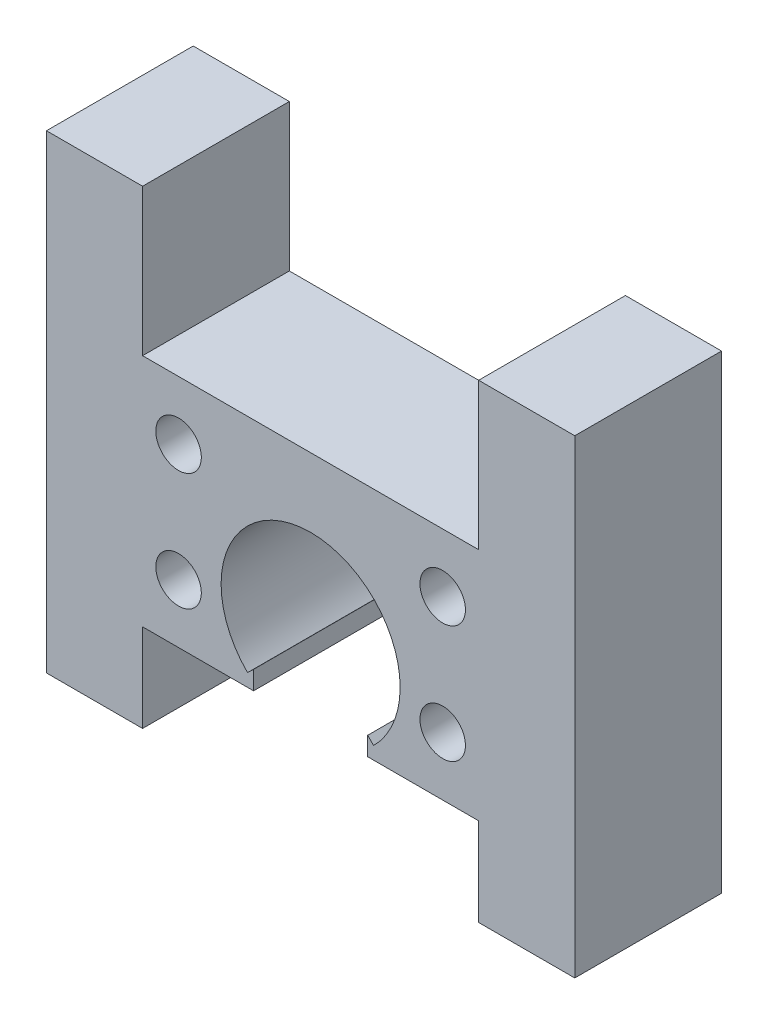
ISO-10303-21;
HEADER;
FILE_DESCRIPTION(('STEP AP214'),'2;1');
FILE_NAME('part.step','',(''),(''),'','','');
FILE_SCHEMA(('AUTOMOTIVE_DESIGN { 1 0 10303 214 1 1 1 1 }'));
ENDSEC;
DATA;
#1=APPLICATION_CONTEXT('core data for automotive mechanical design processes');
#2=APPLICATION_PROTOCOL_DEFINITION('international standard','automotive_design',2000,#1);
#3=PRODUCT_CONTEXT('',#1,'mechanical');
#4=PRODUCT('Part','Part','',(#3));
#5=PRODUCT_RELATED_PRODUCT_CATEGORY('part','',(#4));
#6=PRODUCT_DEFINITION_FORMATION('','',#4);
#7=PRODUCT_DEFINITION_CONTEXT('part definition',#1,'design');
#8=PRODUCT_DEFINITION('design','',#6,#7);
#9=PRODUCT_DEFINITION_SHAPE('','',#8);
#10=(LENGTH_UNIT() NAMED_UNIT(*) SI_UNIT(.MILLI.,.METRE.));
#11=(NAMED_UNIT(*) PLANE_ANGLE_UNIT() SI_UNIT($,.RADIAN.));
#12=(NAMED_UNIT(*) SI_UNIT($,.STERADIAN.) SOLID_ANGLE_UNIT());
#13=UNCERTAINTY_MEASURE_WITH_UNIT(LENGTH_MEASURE(1.E-05),#10,'distance_accuracy_value','');
#14=(GEOMETRIC_REPRESENTATION_CONTEXT(3) GLOBAL_UNCERTAINTY_ASSIGNED_CONTEXT((#13)) GLOBAL_UNIT_ASSIGNED_CONTEXT((#10,
#11,#12)) REPRESENTATION_CONTEXT('',''));
#15=CARTESIAN_POINT('',(0.,0.,0.));
#16=DIRECTION('',(0.,0.,1.));
#17=DIRECTION('',(1.,0.,0.));
#18=AXIS2_PLACEMENT_3D('',#15,#16,#17);
#19=CARTESIAN_POINT('',(71.5029820344726,0.,-10.));
#20=DIRECTION('',(0.,1.,0.));
#21=DIRECTION('',(-1.,0.,0.));
#22=AXIS2_PLACEMENT_3D('',#19,#20,#21);
#23=PLANE('',#22);
#24=DIRECTION('',(-1.,0.,0.));
#25=VECTOR('',#24,1.);
#26=CARTESIAN_POINT('',(71.5029820344726,0.,-10.));
#27=LINE('',#26,#25);
#28=CARTESIAN_POINT('',(64.9529820344231,0.,-10.));
#29=VERTEX_POINT('',#28);
#30=CARTESIAN_POINT('',(42.0529820346687,0.,-9.99999999999999));
#31=VERTEX_POINT('',#30);
#32=EDGE_CURVE('E245',#29,#31,#27,.T.);
#33=ORIENTED_EDGE('',*,*,#32,.T.);
#34=DIRECTION('',(0.,0.,-1.));
#35=VECTOR('',#34,1.);
#36=CARTESIAN_POINT('',(42.0529820346687,0.,-9.99999999999999));
#37=LINE('',#36,#35);
#38=CARTESIAN_POINT('',(42.0529820346687,0.,0.));
#39=VERTEX_POINT('',#38);
#40=EDGE_CURVE('E197',#39,#31,#37,.T.);
#41=ORIENTED_EDGE('',*,*,#40,.F.);
#42=DIRECTION('',(-1.,0.,0.));
#43=VECTOR('',#42,1.);
#44=CARTESIAN_POINT('',(71.5029820344726,0.,0.));
#45=LINE('',#44,#43);
#46=CARTESIAN_POINT('',(64.9529820344231,0.,0.));
#47=VERTEX_POINT('',#46);
#48=EDGE_CURVE('E181',#47,#39,#45,.T.);
#49=ORIENTED_EDGE('',*,*,#48,.F.);
#50=DIRECTION('',(0.,0.,1.));
#51=VECTOR('',#50,1.);
#52=CARTESIAN_POINT('',(64.9529820344231,0.,0.));
#53=LINE('',#52,#51);
#54=EDGE_CURVE('E57',#29,#47,#53,.T.);
#55=ORIENTED_EDGE('',*,*,#54,.F.);
#56=EDGE_LOOP('',(#33,#41,#49,#55));
#57=FACE_BOUND('',#56,.T.);
#58=ADVANCED_FACE('F40',(#57),#23,.T.);
#59=CARTESIAN_POINT('',(71.5029820344726,-16.,-10.));
#60=DIRECTION('',(0.,-1.,0.));
#61=DIRECTION('',(0.,0.,-1.));
#62=AXIS2_PLACEMENT_3D('',#59,#60,#61);
#63=PLANE('',#62);
#64=DIRECTION('',(1.,0.,0.));
#65=VECTOR('',#64,1.);
#66=CARTESIAN_POINT('',(71.5029820344726,-16.,0.));
#67=LINE('',#66,#65);
#68=CARTESIAN_POINT('',(42.0529820346687,-16.,0.));
#69=VERTEX_POINT('',#68);
#70=CARTESIAN_POINT('',(49.6145376152919,-16.0000000000001,0.));
#71=VERTEX_POINT('',#70);
#72=EDGE_CURVE('E262',#69,#71,#67,.T.);
#73=ORIENTED_EDGE('',*,*,#72,.F.);
#74=DIRECTION('',(0.,0.,1.));
#75=VECTOR('',#74,1.);
#76=CARTESIAN_POINT('',(42.0529820346687,-16.,-9.99999999999999));
#77=LINE('',#76,#75);
#78=CARTESIAN_POINT('',(42.0529820346687,-16.,-9.99999999999999));
#79=VERTEX_POINT('',#78);
#80=EDGE_CURVE('E241',#79,#69,#77,.T.);
#81=ORIENTED_EDGE('',*,*,#80,.F.);
#82=DIRECTION('',(1.,0.,0.));
#83=VECTOR('',#82,1.);
#84=CARTESIAN_POINT('',(71.5029820344726,-16.,-10.));
#85=LINE('',#84,#83);
#86=CARTESIAN_POINT('',(49.6145376152919,-16.0000000000001,-10.));
#87=VERTEX_POINT('',#86);
#88=EDGE_CURVE('E11',#79,#87,#85,.T.);
#89=ORIENTED_EDGE('',*,*,#88,.T.);
#90=DIRECTION('',(0.,0.,-1.));
#91=VECTOR('',#90,1.);
#92=CARTESIAN_POINT('',(49.6145376152919,-16.0000000000001,0.));
#93=LINE('',#92,#91);
#94=EDGE_CURVE('E260',#71,#87,#93,.T.);
#95=ORIENTED_EDGE('',*,*,#94,.F.);
#96=EDGE_LOOP('',(#73,#81,#89,#95));
#97=FACE_BOUND('',#96,.T.);
#98=ADVANCED_FACE('F379',(#97),#63,.T.);
#99=CARTESIAN_POINT('',(57.3914264533813,-16.0000000000001,-10.));
#100=VERTEX_POINT('',#99);
#101=CARTESIAN_POINT('',(64.9529820344726,-16.,-10.));
#102=VERTEX_POINT('',#101);
#103=EDGE_CURVE('E49',#100,#102,#85,.T.);
#104=ORIENTED_EDGE('',*,*,#103,.T.);
#105=DIRECTION('',(0.,0.,-1.));
#106=VECTOR('',#105,1.);
#107=CARTESIAN_POINT('',(64.9529820344726,-16.,0.));
#108=LINE('',#107,#106);
#109=CARTESIAN_POINT('',(64.9529820344726,-16.,0.));
#110=VERTEX_POINT('',#109);
#111=EDGE_CURVE('E283',#110,#102,#108,.T.);
#112=ORIENTED_EDGE('',*,*,#111,.F.);
#113=CARTESIAN_POINT('',(57.3914264533813,-16.0000000000001,0.));
#114=VERTEX_POINT('',#113);
#115=EDGE_CURVE('E180',#114,#110,#67,.T.);
#116=ORIENTED_EDGE('',*,*,#115,.F.);
#117=DIRECTION('',(0.,0.,-1.));
#118=VECTOR('',#117,1.);
#119=CARTESIAN_POINT('',(57.3914264533813,-16.0000000000001,0.));
#120=LINE('',#119,#118);
#121=EDGE_CURVE('E281',#114,#100,#120,.T.);
#122=ORIENTED_EDGE('',*,*,#121,.T.);
#123=EDGE_LOOP('',(#104,#112,#116,#122));
#124=FACE_BOUND('',#123,.T.);
#125=ADVANCED_FACE('F280',(#124),#63,.T.);
#126=CARTESIAN_POINT('',(71.5029820344726,0.,-10.));
#127=DIRECTION('',(1.,0.,0.));
#128=DIRECTION('',(0.,0.,-1.));
#129=AXIS2_PLACEMENT_3D('',#126,#127,#128);
#130=PLANE('',#129);
#131=DIRECTION('',(0.,1.,0.));
#132=VECTOR('',#131,1.);
#133=CARTESIAN_POINT('',(71.5029820344726,0.,0.));
#134=LINE('',#133,#132);
#135=CARTESIAN_POINT('',(71.5029820344726,-22.,0.));
#136=VERTEX_POINT('',#135);
#137=CARTESIAN_POINT('',(71.5029820344231,10.,0.));
#138=VERTEX_POINT('',#137);
#139=EDGE_CURVE('E258',#136,#138,#134,.T.);
#140=ORIENTED_EDGE('',*,*,#139,.F.);
#141=DIRECTION('',(0.,0.,1.));
#142=VECTOR('',#141,1.);
#143=CARTESIAN_POINT('',(71.5029820344726,-22.,-10.));
#144=LINE('',#143,#142);
#145=CARTESIAN_POINT('',(71.5029820344726,-22.,-10.));
#146=VERTEX_POINT('',#145);
#147=EDGE_CURVE('E291',#146,#136,#144,.T.);
#148=ORIENTED_EDGE('',*,*,#147,.F.);
#149=DIRECTION('',(0.,1.,0.));
#150=VECTOR('',#149,1.);
#151=CARTESIAN_POINT('',(71.5029820344726,0.,-10.));
#152=LINE('',#151,#150);
#153=CARTESIAN_POINT('',(71.5029820344231,10.,-10.));
#154=VERTEX_POINT('',#153);
#155=EDGE_CURVE('E250',#146,#154,#152,.T.);
#156=ORIENTED_EDGE('',*,*,#155,.T.);
#157=DIRECTION('',(0.,0.,-1.));
#158=VECTOR('',#157,1.);
#159=CARTESIAN_POINT('',(71.5029820344231,10.,-10.));
#160=LINE('',#159,#158);
#161=EDGE_CURVE('E219',#138,#154,#160,.T.);
#162=ORIENTED_EDGE('',*,*,#161,.F.);
#163=EDGE_LOOP('',(#140,#148,#156,#162));
#164=FACE_BOUND('',#163,.T.);
#165=ADVANCED_FACE('F42',(#164),#130,.T.);
#166=CARTESIAN_POINT('',(35.5029820344726,0.,-10.));
#167=DIRECTION('',(-1.,0.,0.));
#168=DIRECTION('',(0.,0.,1.));
#169=AXIS2_PLACEMENT_3D('',#166,#167,#168);
#170=PLANE('',#169);
#171=DIRECTION('',(0.,-1.,0.));
#172=VECTOR('',#171,1.);
#173=CARTESIAN_POINT('',(35.5029820344726,0.,0.));
#174=LINE('',#173,#172);
#175=CARTESIAN_POINT('',(35.5029820346687,10.,0.));
#176=VERTEX_POINT('',#175);
#177=CARTESIAN_POINT('',(35.5029820346687,-22.,0.));
#178=VERTEX_POINT('',#177);
#179=EDGE_CURVE('E172',#176,#178,#174,.T.);
#180=ORIENTED_EDGE('',*,*,#179,.F.);
#181=DIRECTION('',(0.,0.,1.));
#182=VECTOR('',#181,1.);
#183=CARTESIAN_POINT('',(35.5029820346687,10.,0.));
#184=LINE('',#183,#182);
#185=CARTESIAN_POINT('',(35.5029820346687,10.,-9.99999999999999));
#186=VERTEX_POINT('',#185);
#187=EDGE_CURVE('E176',#186,#176,#184,.T.);
#188=ORIENTED_EDGE('',*,*,#187,.F.);
#189=DIRECTION('',(0.,-1.,0.));
#190=VECTOR('',#189,1.);
#191=CARTESIAN_POINT('',(35.5029820344726,0.,-10.));
#192=LINE('',#191,#190);
#193=CARTESIAN_POINT('',(35.5029820346687,-22.,-9.99999999999999));
#194=VERTEX_POINT('',#193);
#195=EDGE_CURVE('E249',#186,#194,#192,.T.);
#196=ORIENTED_EDGE('',*,*,#195,.T.);
#197=DIRECTION('',(0.,0.,-1.));
#198=VECTOR('',#197,1.);
#199=CARTESIAN_POINT('',(35.5029820346687,-22.,-9.99999999999999));
#200=LINE('',#199,#198);
#201=EDGE_CURVE('E178',#178,#194,#200,.T.);
#202=ORIENTED_EDGE('',*,*,#201,.F.);
#203=EDGE_LOOP('',(#180,#188,#196,#202));
#204=FACE_BOUND('',#203,.T.);
#205=ADVANCED_FACE('F174',(#204),#170,.T.);
#206=CARTESIAN_POINT('',(0.,0.,-10.));
#207=DIRECTION('',(0.,0.,-1.));
#208=DIRECTION('',(-1.,0.,0.));
#209=AXIS2_PLACEMENT_3D('',#206,#207,#208);
#210=PLANE('',#209);
#211=CARTESIAN_POINT('',(62.5029820343366,-4.00000000000243,-10.));
#212=DIRECTION('',(0.,0.,-1.));
#213=DIRECTION('',(-1.,0.,0.));
#214=AXIS2_PLACEMENT_3D('',#211,#212,#213);
#215=CIRCLE('',#214,1.54999999987086);
#216=CARTESIAN_POINT('',(60.9529820344657,-4.00000000000243,-10.));
#217=VERTEX_POINT('',#216);
#218=EDGE_CURVE('E301',#217,#217,#215,.T.);
#219=ORIENTED_EDGE('',*,*,#218,.F.);
#220=EDGE_LOOP('',(#219));
#221=FACE_BOUND('',#220,.T.);
#222=CARTESIAN_POINT('',(62.5029820343366,-12.0000000000024,-10.));
#223=DIRECTION('',(0.,0.,-1.));
#224=DIRECTION('',(-1.,0.,0.));
#225=AXIS2_PLACEMENT_3D('',#222,#223,#224);
#226=CIRCLE('',#225,1.54999999987086);
#227=CARTESIAN_POINT('',(60.9529820344657,-12.0000000000024,-10.));
#228=VERTEX_POINT('',#227);
#229=EDGE_CURVE('E306',#228,#228,#226,.T.);
#230=ORIENTED_EDGE('',*,*,#229,.F.);
#231=EDGE_LOOP('',(#230));
#232=FACE_BOUND('',#231,.T.);
#233=CARTESIAN_POINT('',(44.5029820343366,-4.00000000000243,-10.));
#234=DIRECTION('',(0.,0.,-1.));
#235=DIRECTION('',(-1.,0.,0.));
#236=AXIS2_PLACEMENT_3D('',#233,#234,#235);
#237=CIRCLE('',#236,1.54999999985976);
#238=CARTESIAN_POINT('',(42.9529820344768,-4.00000000000243,-10.));
#239=VERTEX_POINT('',#238);
#240=EDGE_CURVE('E312',#239,#239,#237,.T.);
#241=ORIENTED_EDGE('',*,*,#240,.F.);
#242=EDGE_LOOP('',(#241));
#243=FACE_BOUND('',#242,.T.);
#244=CARTESIAN_POINT('',(44.5029820343366,-12.0000000000024,-10.));
#245=DIRECTION('',(0.,0.,-1.));
#246=DIRECTION('',(-1.,0.,0.));
#247=AXIS2_PLACEMENT_3D('',#244,#245,#246);
#248=CIRCLE('',#247,1.54999999987087);
#249=CARTESIAN_POINT('',(42.9529820344657,-12.0000000000024,-10.));
#250=VERTEX_POINT('',#249);
#251=EDGE_CURVE('E318',#250,#250,#248,.T.);
#252=ORIENTED_EDGE('',*,*,#251,.F.);
#253=EDGE_LOOP('',(#252));
#254=FACE_BOUND('',#253,.T.);
#255=DIRECTION('',(0.,1.,0.));
#256=VECTOR('',#255,1.);
#257=CARTESIAN_POINT('',(49.6145376152919,-14.7305411481412,-10.));
#258=LINE('',#257,#256);
#259=CARTESIAN_POINT('',(49.6145376152919,-14.7305411481412,-10.));
#260=VERTEX_POINT('',#259);
#261=EDGE_CURVE('E324',#87,#260,#258,.T.);
#262=ORIENTED_EDGE('',*,*,#261,.F.);
#263=ORIENTED_EDGE('',*,*,#88,.F.);
#264=DIRECTION('',(0.,1.,0.));
#265=VECTOR('',#264,1.);
#266=CARTESIAN_POINT('',(42.0529820346687,-22.,-9.99999999999999));
#267=LINE('',#266,#265);
#268=CARTESIAN_POINT('',(42.0529820346687,-22.,-9.99999999999999));
#269=VERTEX_POINT('',#268);
#270=EDGE_CURVE('E288',#269,#79,#267,.T.);
#271=ORIENTED_EDGE('',*,*,#270,.F.);
#272=DIRECTION('',(1.,0.,0.));
#273=VECTOR('',#272,1.);
#274=CARTESIAN_POINT('',(35.5029820346687,-22.,-9.99999999999999));
#275=LINE('',#274,#273);
#276=EDGE_CURVE('E227',#194,#269,#275,.T.);
#277=ORIENTED_EDGE('',*,*,#276,.F.);
#278=ORIENTED_EDGE('',*,*,#195,.F.);
#279=DIRECTION('',(-1.,0.,0.));
#280=VECTOR('',#279,1.);
#281=CARTESIAN_POINT('',(35.5029820346687,10.,-9.99999999999999));
#282=LINE('',#281,#280);
#283=CARTESIAN_POINT('',(42.0529820346687,10.,-9.99999999999999));
#284=VERTEX_POINT('',#283);
#285=EDGE_CURVE('E196',#284,#186,#282,.T.);
#286=ORIENTED_EDGE('',*,*,#285,.F.);
#287=DIRECTION('',(0.,-1.,0.));
#288=VECTOR('',#287,1.);
#289=CARTESIAN_POINT('',(42.0529820346687,10.,-9.99999999999999));
#290=LINE('',#289,#288);
#291=EDGE_CURVE('E204',#284,#31,#290,.T.);
#292=ORIENTED_EDGE('',*,*,#291,.T.);
#293=ORIENTED_EDGE('',*,*,#32,.F.);
#294=DIRECTION('',(0.,-1.,0.));
#295=VECTOR('',#294,1.);
#296=CARTESIAN_POINT('',(64.9529820344231,10.,-10.));
#297=LINE('',#296,#295);
#298=CARTESIAN_POINT('',(64.9529820344231,10.,-10.));
#299=VERTEX_POINT('',#298);
#300=EDGE_CURVE('E224',#299,#29,#297,.T.);
#301=ORIENTED_EDGE('',*,*,#300,.F.);
#302=DIRECTION('',(-1.,0.,0.));
#303=VECTOR('',#302,1.);
#304=CARTESIAN_POINT('',(64.9529820344231,10.,-10.));
#305=LINE('',#304,#303);
#306=EDGE_CURVE('E222',#154,#299,#305,.T.);
#307=ORIENTED_EDGE('',*,*,#306,.F.);
#308=ORIENTED_EDGE('',*,*,#155,.F.);
#309=DIRECTION('',(1.,0.,0.));
#310=VECTOR('',#309,1.);
#311=CARTESIAN_POINT('',(64.9529820344726,-22.,-10.));
#312=LINE('',#311,#310);
#313=CARTESIAN_POINT('',(64.9529820344726,-22.,-10.));
#314=VERTEX_POINT('',#313);
#315=EDGE_CURVE('E287',#314,#146,#312,.T.);
#316=ORIENTED_EDGE('',*,*,#315,.F.);
#317=DIRECTION('',(0.,1.,0.));
#318=VECTOR('',#317,1.);
#319=CARTESIAN_POINT('',(64.9529820344726,-22.,-10.));
#320=LINE('',#319,#318);
#321=EDGE_CURVE('E298',#314,#102,#320,.T.);
#322=ORIENTED_EDGE('',*,*,#321,.T.);
#323=ORIENTED_EDGE('',*,*,#103,.F.);
#324=DIRECTION('',(0.,-1.,0.));
#325=VECTOR('',#324,1.);
#326=CARTESIAN_POINT('',(57.3914264533813,-16.0000000000001,-10.));
#327=LINE('',#326,#325);
#328=CARTESIAN_POINT('',(57.3914264533813,-14.7305411481412,-10.));
#329=VERTEX_POINT('',#328);
#330=EDGE_CURVE('E330',#329,#100,#327,.T.);
#331=ORIENTED_EDGE('',*,*,#330,.F.);
#332=DIRECTION('',(-0.707106781186558,0.707106781186537,0.));
#333=VECTOR('',#332,1.);
#334=CARTESIAN_POINT('',(57.3914264533813,-14.7305411481412,-10.));
#335=LINE('',#334,#333);
#336=CARTESIAN_POINT('',(57.7952336786401,-15.1343483734,-10.));
#337=VERTEX_POINT('',#336);
#338=EDGE_CURVE('E348',#337,#329,#335,.T.);
#339=ORIENTED_EDGE('',*,*,#338,.F.);
#340=CARTESIAN_POINT('',(53.5029820343366,-10.8000000000024,-10.));
#341=DIRECTION('',(0.,0.,-1.));
#342=DIRECTION('',(-1.,0.,0.));
#343=AXIS2_PLACEMENT_3D('',#340,#341,#342);
#344=CIRCLE('',#343,6.1);
#345=CARTESIAN_POINT('',(49.2043973962509,-15.128067710796,-10.));
#346=VERTEX_POINT('',#345);
#347=EDGE_CURVE('E345',#346,#337,#344,.T.);
#348=ORIENTED_EDGE('',*,*,#347,.F.);
#349=DIRECTION('',(-0.718062388144035,-0.695978740144327,0.));
#350=VECTOR('',#349,1.);
#351=CARTESIAN_POINT('',(49.2043973962509,-15.128067710796,-10.));
#352=LINE('',#351,#350);
#353=EDGE_CURVE('E342',#260,#346,#352,.T.);
#354=ORIENTED_EDGE('',*,*,#353,.F.);
#355=EDGE_LOOP('',(#262,#263,#271,#277,#278,#286,#292,#293,#301,#307,#308,#316,#322,#323,#331,
#339,#348,#354));
#356=FACE_BOUND('',#355,.T.);
#357=ADVANCED_FACE('F372',(#221,#232,#243,#254,#356),#210,.T.);
#358=CARTESIAN_POINT('',(0.,0.,0.));
#359=DIRECTION('',(0.,0.,-1.));
#360=DIRECTION('',(-1.,0.,0.));
#361=AXIS2_PLACEMENT_3D('',#358,#359,#360);
#362=PLANE('',#361);
#363=CARTESIAN_POINT('',(62.5029820343366,-4.00000000000243,0.));
#364=DIRECTION('',(0.,0.,-1.));
#365=DIRECTION('',(-1.,0.,0.));
#366=AXIS2_PLACEMENT_3D('',#363,#364,#365);
#367=CIRCLE('',#366,1.54999999987086);
#368=CARTESIAN_POINT('',(60.9529820344657,-4.00000000000243,0.));
#369=VERTEX_POINT('',#368);
#370=EDGE_CURVE('E302',#369,#369,#367,.T.);
#371=ORIENTED_EDGE('',*,*,#370,.T.);
#372=EDGE_LOOP('',(#371));
#373=FACE_BOUND('',#372,.T.);
#374=CARTESIAN_POINT('',(62.5029820343366,-12.0000000000024,0.));
#375=DIRECTION('',(0.,0.,-1.));
#376=DIRECTION('',(-1.,0.,0.));
#377=AXIS2_PLACEMENT_3D('',#374,#375,#376);
#378=CIRCLE('',#377,1.54999999987086);
#379=CARTESIAN_POINT('',(60.9529820344657,-12.0000000000024,0.));
#380=VERTEX_POINT('',#379);
#381=EDGE_CURVE('E309',#380,#380,#378,.T.);
#382=ORIENTED_EDGE('',*,*,#381,.T.);
#383=EDGE_LOOP('',(#382));
#384=FACE_BOUND('',#383,.T.);
#385=CARTESIAN_POINT('',(44.5029820343366,-4.00000000000243,0.));
#386=DIRECTION('',(0.,0.,-1.));
#387=DIRECTION('',(-1.,0.,0.));
#388=AXIS2_PLACEMENT_3D('',#385,#386,#387);
#389=CIRCLE('',#388,1.54999999985976);
#390=CARTESIAN_POINT('',(42.9529820344768,-4.00000000000243,0.));
#391=VERTEX_POINT('',#390);
#392=EDGE_CURVE('E315',#391,#391,#389,.T.);
#393=ORIENTED_EDGE('',*,*,#392,.T.);
#394=EDGE_LOOP('',(#393));
#395=FACE_BOUND('',#394,.T.);
#396=CARTESIAN_POINT('',(44.5029820343366,-12.0000000000024,0.));
#397=DIRECTION('',(0.,0.,-1.));
#398=DIRECTION('',(-1.,0.,0.));
#399=AXIS2_PLACEMENT_3D('',#396,#397,#398);
#400=CIRCLE('',#399,1.54999999987087);
#401=CARTESIAN_POINT('',(42.9529820344657,-12.0000000000024,0.));
#402=VERTEX_POINT('',#401);
#403=EDGE_CURVE('E321',#402,#402,#400,.T.);
#404=ORIENTED_EDGE('',*,*,#403,.T.);
#405=EDGE_LOOP('',(#404));
#406=FACE_BOUND('',#405,.T.);
#407=ORIENTED_EDGE('',*,*,#179,.T.);
#408=DIRECTION('',(-1.,0.,0.));
#409=VECTOR('',#408,1.);
#410=CARTESIAN_POINT('',(35.5029820346687,-22.,0.));
#411=LINE('',#410,#409);
#412=CARTESIAN_POINT('',(42.0529820346687,-22.,0.));
#413=VERTEX_POINT('',#412);
#414=EDGE_CURVE('E388',#413,#178,#411,.T.);
#415=ORIENTED_EDGE('',*,*,#414,.F.);
#416=DIRECTION('',(0.,1.,0.));
#417=VECTOR('',#416,1.);
#418=CARTESIAN_POINT('',(42.0529820346687,-22.,0.));
#419=LINE('',#418,#417);
#420=EDGE_CURVE('E65',#413,#69,#419,.T.);
#421=ORIENTED_EDGE('',*,*,#420,.T.);
#422=ORIENTED_EDGE('',*,*,#72,.T.);
#423=DIRECTION('',(0.,1.,0.));
#424=VECTOR('',#423,1.);
#425=CARTESIAN_POINT('',(49.6145376152919,-14.7305411481412,0.));
#426=LINE('',#425,#424);
#427=CARTESIAN_POINT('',(49.6145376152919,-14.7305411481412,0.));
#428=VERTEX_POINT('',#427);
#429=EDGE_CURVE('E327',#71,#428,#426,.T.);
#430=ORIENTED_EDGE('',*,*,#429,.T.);
#431=DIRECTION('',(-0.718062388144035,-0.695978740144327,0.));
#432=VECTOR('',#431,1.);
#433=CARTESIAN_POINT('',(49.2043973962509,-15.128067710796,0.));
#434=LINE('',#433,#432);
#435=CARTESIAN_POINT('',(49.2043973962509,-15.1280677107961,0.));
#436=VERTEX_POINT('',#435);
#437=EDGE_CURVE('E329',#428,#436,#434,.T.);
#438=ORIENTED_EDGE('',*,*,#437,.T.);
#439=CARTESIAN_POINT('',(53.5029820343366,-10.8000000000024,0.));
#440=DIRECTION('',(0.,0.,-1.));
#441=DIRECTION('',(-1.,0.,0.));
#442=AXIS2_PLACEMENT_3D('',#439,#440,#441);
#443=CIRCLE('',#442,6.1);
#444=CARTESIAN_POINT('',(57.7952336786401,-15.1343483734,0.));
#445=VERTEX_POINT('',#444);
#446=EDGE_CURVE('E333',#436,#445,#443,.T.);
#447=ORIENTED_EDGE('',*,*,#446,.T.);
#448=DIRECTION('',(-0.707106781186558,0.707106781186537,0.));
#449=VECTOR('',#448,1.);
#450=CARTESIAN_POINT('',(57.3914264533813,-14.7305411481412,0.));
#451=LINE('',#450,#449);
#452=CARTESIAN_POINT('',(57.3914264533813,-14.7305411481412,0.));
#453=VERTEX_POINT('',#452);
#454=EDGE_CURVE('E336',#445,#453,#451,.T.);
#455=ORIENTED_EDGE('',*,*,#454,.T.);
#456=DIRECTION('',(0.,-1.,0.));
#457=VECTOR('',#456,1.);
#458=CARTESIAN_POINT('',(57.3914264533813,-16.0000000000001,0.));
#459=LINE('',#458,#457);
#460=EDGE_CURVE('E275',#453,#114,#459,.T.);
#461=ORIENTED_EDGE('',*,*,#460,.T.);
#462=ORIENTED_EDGE('',*,*,#115,.T.);
#463=DIRECTION('',(0.,1.,0.));
#464=VECTOR('',#463,1.);
#465=CARTESIAN_POINT('',(64.9529820344726,-22.,0.));
#466=LINE('',#465,#464);
#467=CARTESIAN_POINT('',(64.9529820344726,-22.,0.));
#468=VERTEX_POINT('',#467);
#469=EDGE_CURVE('E271',#468,#110,#466,.T.);
#470=ORIENTED_EDGE('',*,*,#469,.F.);
#471=DIRECTION('',(-1.,0.,0.));
#472=VECTOR('',#471,1.);
#473=CARTESIAN_POINT('',(71.5029820344726,-22.,0.));
#474=LINE('',#473,#472);
#475=EDGE_CURVE('E395',#136,#468,#474,.T.);
#476=ORIENTED_EDGE('',*,*,#475,.F.);
#477=ORIENTED_EDGE('',*,*,#139,.T.);
#478=DIRECTION('',(1.,0.,0.));
#479=VECTOR('',#478,1.);
#480=CARTESIAN_POINT('',(71.5029820344231,10.,0.));
#481=LINE('',#480,#479);
#482=CARTESIAN_POINT('',(64.9529820344231,10.,0.));
#483=VERTEX_POINT('',#482);
#484=EDGE_CURVE('E215',#483,#138,#481,.T.);
#485=ORIENTED_EDGE('',*,*,#484,.F.);
#486=DIRECTION('',(0.,-1.,0.));
#487=VECTOR('',#486,1.);
#488=CARTESIAN_POINT('',(64.9529820344231,10.,0.));
#489=LINE('',#488,#487);
#490=EDGE_CURVE('E235',#483,#47,#489,.T.);
#491=ORIENTED_EDGE('',*,*,#490,.T.);
#492=ORIENTED_EDGE('',*,*,#48,.T.);
#493=DIRECTION('',(0.,-1.,0.));
#494=VECTOR('',#493,1.);
#495=CARTESIAN_POINT('',(42.0529820346687,10.,0.));
#496=LINE('',#495,#494);
#497=CARTESIAN_POINT('',(42.0529820346687,10.,0.));
#498=VERTEX_POINT('',#497);
#499=EDGE_CURVE('E187',#498,#39,#496,.T.);
#500=ORIENTED_EDGE('',*,*,#499,.F.);
#501=DIRECTION('',(1.,0.,0.));
#502=VECTOR('',#501,1.);
#503=CARTESIAN_POINT('',(42.0529820346687,10.,0.));
#504=LINE('',#503,#502);
#505=EDGE_CURVE('E184',#176,#498,#504,.T.);
#506=ORIENTED_EDGE('',*,*,#505,.F.);
#507=EDGE_LOOP('',(#407,#415,#421,#422,#430,#438,#447,#455,#461,#462,#470,#476,#477,#485,#491,
#492,#500,#506));
#508=FACE_BOUND('',#507,.T.);
#509=ADVANCED_FACE('F185',(#373,#384,#395,#406,#508),#362,.F.);
#510=CARTESIAN_POINT('',(49.6145376152919,-14.7305411481412,0.));
#511=DIRECTION('',(-1.,0.,0.));
#512=DIRECTION('',(0.,0.,1.));
#513=AXIS2_PLACEMENT_3D('',#510,#511,#512);
#514=PLANE('',#513);
#515=ORIENTED_EDGE('',*,*,#261,.T.);
#516=DIRECTION('',(0.,0.,-1.));
#517=VECTOR('',#516,1.);
#518=CARTESIAN_POINT('',(49.6145376152919,-14.7305411481412,0.));
#519=LINE('',#518,#517);
#520=EDGE_CURVE('E339',#428,#260,#519,.T.);
#521=ORIENTED_EDGE('',*,*,#520,.F.);
#522=ORIENTED_EDGE('',*,*,#429,.F.);
#523=ORIENTED_EDGE('',*,*,#94,.T.);
#524=EDGE_LOOP('',(#515,#521,#522,#523));
#525=FACE_BOUND('',#524,.T.);
#526=ADVANCED_FACE('F368',(#525),#514,.F.);
#527=CARTESIAN_POINT('',(57.3914264533813,-16.0000000000001,0.));
#528=DIRECTION('',(1.,0.,0.));
#529=DIRECTION('',(0.,0.,-1.));
#530=AXIS2_PLACEMENT_3D('',#527,#528,#529);
#531=PLANE('',#530);
#532=ORIENTED_EDGE('',*,*,#330,.T.);
#533=ORIENTED_EDGE('',*,*,#121,.F.);
#534=ORIENTED_EDGE('',*,*,#460,.F.);
#535=DIRECTION('',(0.,0.,-1.));
#536=VECTOR('',#535,1.);
#537=CARTESIAN_POINT('',(57.3914264533813,-14.7305411481412,0.));
#538=LINE('',#537,#536);
#539=EDGE_CURVE('E355',#453,#329,#538,.T.);
#540=ORIENTED_EDGE('',*,*,#539,.T.);
#541=EDGE_LOOP('',(#532,#533,#534,#540));
#542=FACE_BOUND('',#541,.T.);
#543=ADVANCED_FACE('F433',(#542),#531,.F.);
#544=CARTESIAN_POINT('',(57.3914264533813,-14.7305411481412,0.));
#545=DIRECTION('',(-0.707106781186537,-0.707106781186558,0.));
#546=DIRECTION('',(0.707106781186558,-0.707106781186537,0.));
#547=AXIS2_PLACEMENT_3D('',#544,#545,#546);
#548=PLANE('',#547);
#549=ORIENTED_EDGE('',*,*,#338,.T.);
#550=ORIENTED_EDGE('',*,*,#539,.F.);
#551=ORIENTED_EDGE('',*,*,#454,.F.);
#552=DIRECTION('',(0.,0.,-1.));
#553=VECTOR('',#552,1.);
#554=CARTESIAN_POINT('',(57.7952336786401,-15.1343483734,0.));
#555=LINE('',#554,#553);
#556=EDGE_CURVE('E357',#445,#337,#555,.T.);
#557=ORIENTED_EDGE('',*,*,#556,.T.);
#558=EDGE_LOOP('',(#549,#550,#551,#557));
#559=FACE_BOUND('',#558,.T.);
#560=ADVANCED_FACE('F439',(#559),#548,.F.);
#561=CARTESIAN_POINT('',(53.5029820343366,-10.8000000000024,0.));
#562=DIRECTION('',(0.,0.,-1.));
#563=DIRECTION('',(-1.,0.,0.));
#564=AXIS2_PLACEMENT_3D('',#561,#562,#563);
#565=CYLINDRICAL_SURFACE('',#564,6.1);
#566=ORIENTED_EDGE('',*,*,#347,.T.);
#567=ORIENTED_EDGE('',*,*,#556,.F.);
#568=ORIENTED_EDGE('',*,*,#446,.F.);
#569=DIRECTION('',(0.,0.,-1.));
#570=VECTOR('',#569,1.);
#571=CARTESIAN_POINT('',(49.2043973962509,-15.128067710796,0.));
#572=LINE('',#571,#570);
#573=EDGE_CURVE('E359',#436,#346,#572,.T.);
#574=ORIENTED_EDGE('',*,*,#573,.T.);
#575=EDGE_LOOP('',(#566,#567,#568,#574));
#576=FACE_BOUND('',#575,.T.);
#577=ADVANCED_FACE('F376',(#576),#565,.F.);
#578=CARTESIAN_POINT('',(49.2043973962509,-15.128067710796,0.));
#579=DIRECTION('',(0.695978740144327,-0.718062388144035,0.));
#580=DIRECTION('',(0.718062388144035,0.695978740144327,0.));
#581=AXIS2_PLACEMENT_3D('',#578,#579,#580);
#582=PLANE('',#581);
#583=ORIENTED_EDGE('',*,*,#353,.T.);
#584=ORIENTED_EDGE('',*,*,#573,.F.);
#585=ORIENTED_EDGE('',*,*,#437,.F.);
#586=ORIENTED_EDGE('',*,*,#520,.T.);
#587=EDGE_LOOP('',(#583,#584,#585,#586));
#588=FACE_BOUND('',#587,.T.);
#589=ADVANCED_FACE('F362',(#588),#582,.F.);
#590=CARTESIAN_POINT('',(44.5029820343366,-12.0000000000024,0.));
#591=DIRECTION('',(0.,0.,-1.));
#592=DIRECTION('',(-1.,0.,0.));
#593=AXIS2_PLACEMENT_3D('',#590,#591,#592);
#594=CYLINDRICAL_SURFACE('',#593,1.54999999987087);
#595=ORIENTED_EDGE('',*,*,#403,.F.);
#596=EDGE_LOOP('',(#595));
#597=FACE_BOUND('',#596,.T.);
#598=ORIENTED_EDGE('',*,*,#251,.T.);
#599=EDGE_LOOP('',(#598));
#600=FACE_BOUND('',#599,.T.);
#601=ADVANCED_FACE('F436',(#597,#600),#594,.F.);
#602=CARTESIAN_POINT('',(44.5029820343366,-4.00000000000243,0.));
#603=DIRECTION('',(0.,0.,-1.));
#604=DIRECTION('',(-1.,0.,0.));
#605=AXIS2_PLACEMENT_3D('',#602,#603,#604);
#606=CYLINDRICAL_SURFACE('',#605,1.54999999985976);
#607=ORIENTED_EDGE('',*,*,#392,.F.);
#608=EDGE_LOOP('',(#607));
#609=FACE_BOUND('',#608,.T.);
#610=ORIENTED_EDGE('',*,*,#240,.T.);
#611=EDGE_LOOP('',(#610));
#612=FACE_BOUND('',#611,.T.);
#613=ADVANCED_FACE('F448',(#609,#612),#606,.F.);
#614=CARTESIAN_POINT('',(62.5029820343366,-12.0000000000024,0.));
#615=DIRECTION('',(0.,0.,-1.));
#616=DIRECTION('',(-1.,0.,0.));
#617=AXIS2_PLACEMENT_3D('',#614,#615,#616);
#618=CYLINDRICAL_SURFACE('',#617,1.54999999987086);
#619=ORIENTED_EDGE('',*,*,#381,.F.);
#620=EDGE_LOOP('',(#619));
#621=FACE_BOUND('',#620,.T.);
#622=ORIENTED_EDGE('',*,*,#229,.T.);
#623=EDGE_LOOP('',(#622));
#624=FACE_BOUND('',#623,.T.);
#625=ADVANCED_FACE('F452',(#621,#624),#618,.F.);
#626=CARTESIAN_POINT('',(62.5029820343366,-4.00000000000243,0.));
#627=DIRECTION('',(0.,0.,-1.));
#628=DIRECTION('',(-1.,0.,0.));
#629=AXIS2_PLACEMENT_3D('',#626,#627,#628);
#630=CYLINDRICAL_SURFACE('',#629,1.54999999987086);
#631=ORIENTED_EDGE('',*,*,#370,.F.);
#632=EDGE_LOOP('',(#631));
#633=FACE_BOUND('',#632,.T.);
#634=ORIENTED_EDGE('',*,*,#218,.T.);
#635=EDGE_LOOP('',(#634));
#636=FACE_BOUND('',#635,.T.);
#637=ADVANCED_FACE('F456',(#633,#636),#630,.F.);
#638=CARTESIAN_POINT('',(64.9529820344726,-22.,0.));
#639=DIRECTION('',(1.,0.,0.));
#640=DIRECTION('',(0.,0.,-1.));
#641=AXIS2_PLACEMENT_3D('',#638,#639,#640);
#642=PLANE('',#641);
#643=ORIENTED_EDGE('',*,*,#111,.T.);
#644=ORIENTED_EDGE('',*,*,#321,.F.);
#645=DIRECTION('',(0.,0.,-1.));
#646=VECTOR('',#645,1.);
#647=CARTESIAN_POINT('',(64.9529820344726,-22.,0.));
#648=LINE('',#647,#646);
#649=EDGE_CURVE('E296',#468,#314,#648,.T.);
#650=ORIENTED_EDGE('',*,*,#649,.F.);
#651=ORIENTED_EDGE('',*,*,#469,.T.);
#652=EDGE_LOOP('',(#643,#644,#650,#651));
#653=FACE_BOUND('',#652,.T.);
#654=ADVANCED_FACE('F399',(#653),#642,.F.);
#655=CARTESIAN_POINT('',(0.,-22.,0.));
#656=DIRECTION('',(0.,-1.,0.));
#657=DIRECTION('',(0.,0.,-1.));
#658=AXIS2_PLACEMENT_3D('',#655,#656,#657);
#659=PLANE('',#658);
#660=ORIENTED_EDGE('',*,*,#315,.T.);
#661=ORIENTED_EDGE('',*,*,#147,.T.);
#662=ORIENTED_EDGE('',*,*,#475,.T.);
#663=ORIENTED_EDGE('',*,*,#649,.T.);
#664=EDGE_LOOP('',(#660,#661,#662,#663));
#665=FACE_BOUND('',#664,.T.);
#666=ADVANCED_FACE('F397',(#665),#659,.T.);
#667=CARTESIAN_POINT('',(42.0529820346687,-22.,-9.99999999999999));
#668=DIRECTION('',(-1.,0.,0.));
#669=DIRECTION('',(0.,0.,1.));
#670=AXIS2_PLACEMENT_3D('',#667,#668,#669);
#671=PLANE('',#670);
#672=ORIENTED_EDGE('',*,*,#80,.T.);
#673=ORIENTED_EDGE('',*,*,#420,.F.);
#674=DIRECTION('',(0.,0.,1.));
#675=VECTOR('',#674,1.);
#676=CARTESIAN_POINT('',(42.0529820346687,-22.,-9.99999999999999));
#677=LINE('',#676,#675);
#678=EDGE_CURVE('E386',#269,#413,#677,.T.);
#679=ORIENTED_EDGE('',*,*,#678,.F.);
#680=ORIENTED_EDGE('',*,*,#270,.T.);
#681=EDGE_LOOP('',(#672,#673,#679,#680));
#682=FACE_BOUND('',#681,.T.);
#683=ADVANCED_FACE('F385',(#682),#671,.F.);
#684=CARTESIAN_POINT('',(0.,-22.,0.));
#685=DIRECTION('',(0.,-1.,0.));
#686=DIRECTION('',(0.,0.,-1.));
#687=AXIS2_PLACEMENT_3D('',#684,#685,#686);
#688=PLANE('',#687);
#689=ORIENTED_EDGE('',*,*,#276,.T.);
#690=ORIENTED_EDGE('',*,*,#678,.T.);
#691=ORIENTED_EDGE('',*,*,#414,.T.);
#692=ORIENTED_EDGE('',*,*,#201,.T.);
#693=EDGE_LOOP('',(#689,#690,#691,#692));
#694=FACE_BOUND('',#693,.T.);
#695=ADVANCED_FACE('F389',(#694),#688,.T.);
#696=CARTESIAN_POINT('',(64.9529820344231,10.,0.));
#697=DIRECTION('',(1.,0.,0.));
#698=DIRECTION('',(0.,0.,-1.));
#699=AXIS2_PLACEMENT_3D('',#696,#697,#698);
#700=PLANE('',#699);
#701=ORIENTED_EDGE('',*,*,#54,.T.);
#702=ORIENTED_EDGE('',*,*,#490,.F.);
#703=DIRECTION('',(0.,0.,1.));
#704=VECTOR('',#703,1.);
#705=CARTESIAN_POINT('',(64.9529820344231,10.,0.));
#706=LINE('',#705,#704);
#707=EDGE_CURVE('E211',#299,#483,#706,.T.);
#708=ORIENTED_EDGE('',*,*,#707,.F.);
#709=ORIENTED_EDGE('',*,*,#300,.T.);
#710=EDGE_LOOP('',(#701,#702,#708,#709));
#711=FACE_BOUND('',#710,.T.);
#712=ADVANCED_FACE('F406',(#711),#700,.F.);
#713=CARTESIAN_POINT('',(0.,10.,0.));
#714=DIRECTION('',(0.,-1.,0.));
#715=DIRECTION('',(1.,0.,0.));
#716=AXIS2_PLACEMENT_3D('',#713,#714,#715);
#717=PLANE('',#716);
#718=ORIENTED_EDGE('',*,*,#707,.T.);
#719=ORIENTED_EDGE('',*,*,#484,.T.);
#720=ORIENTED_EDGE('',*,*,#161,.T.);
#721=ORIENTED_EDGE('',*,*,#306,.T.);
#722=EDGE_LOOP('',(#718,#719,#720,#721));
#723=FACE_BOUND('',#722,.T.);
#724=ADVANCED_FACE('F405',(#723),#717,.F.);
#725=CARTESIAN_POINT('',(42.0529820346687,10.,-9.99999999999999));
#726=DIRECTION('',(-1.,0.,0.));
#727=DIRECTION('',(0.,-1.,0.));
#728=AXIS2_PLACEMENT_3D('',#725,#726,#727);
#729=PLANE('',#728);
#730=ORIENTED_EDGE('',*,*,#40,.T.);
#731=ORIENTED_EDGE('',*,*,#291,.F.);
#732=DIRECTION('',(0.,0.,-1.));
#733=VECTOR('',#732,1.);
#734=CARTESIAN_POINT('',(42.0529820346687,10.,-9.99999999999999));
#735=LINE('',#734,#733);
#736=EDGE_CURVE('E191',#498,#284,#735,.T.);
#737=ORIENTED_EDGE('',*,*,#736,.F.);
#738=ORIENTED_EDGE('',*,*,#499,.T.);
#739=EDGE_LOOP('',(#730,#731,#737,#738));
#740=FACE_BOUND('',#739,.T.);
#741=ADVANCED_FACE('F413',(#740),#729,.F.);
#742=CARTESIAN_POINT('',(0.,10.,0.));
#743=DIRECTION('',(0.,-1.,0.));
#744=DIRECTION('',(1.,0.,0.));
#745=AXIS2_PLACEMENT_3D('',#742,#743,#744);
#746=PLANE('',#745);
#747=ORIENTED_EDGE('',*,*,#187,.T.);
#748=ORIENTED_EDGE('',*,*,#505,.T.);
#749=ORIENTED_EDGE('',*,*,#736,.T.);
#750=ORIENTED_EDGE('',*,*,#285,.T.);
#751=EDGE_LOOP('',(#747,#748,#749,#750));
#752=FACE_BOUND('',#751,.T.);
#753=ADVANCED_FACE('F194',(#752),#746,.F.);
#754=CLOSED_SHELL('',(#58,#98,#125,#165,#205,#357,#509,#526,#543,#560,#577,#589,#601,#613,#625,
#637,#654,#666,#683,#695,#712,#724,#741,#753));
#755=MANIFOLD_SOLID_BREP('B2',#754);
#756=ADVANCED_BREP_SHAPE_REPRESENTATION('',(#18,#755),#14);
#757=SHAPE_DEFINITION_REPRESENTATION(#9,#756);
ENDSEC;
END-ISO-10303-21;
